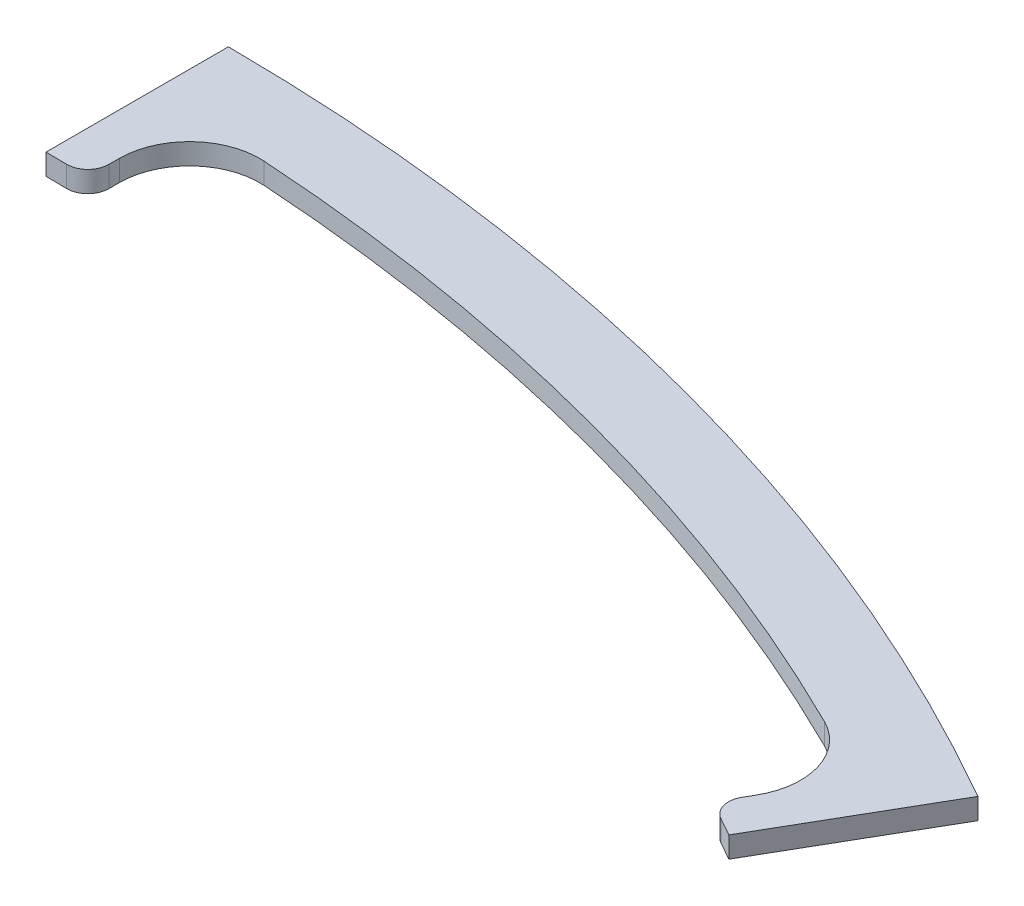
ISO-10303-21;
HEADER;
FILE_DESCRIPTION(('STEP AP214'),'2;1');
FILE_NAME('part.step','',(''),(''),'','','');
FILE_SCHEMA(('AUTOMOTIVE_DESIGN { 1 0 10303 214 1 1 1 1 }'));
ENDSEC;
DATA;
#1=APPLICATION_CONTEXT('core data for automotive mechanical design processes');
#2=APPLICATION_PROTOCOL_DEFINITION('international standard','automotive_design',2000,#1);
#3=PRODUCT_CONTEXT('',#1,'mechanical');
#4=PRODUCT('Part','Part','',(#3));
#5=PRODUCT_RELATED_PRODUCT_CATEGORY('part','',(#4));
#6=PRODUCT_DEFINITION_FORMATION('','',#4);
#7=PRODUCT_DEFINITION_CONTEXT('part definition',#1,'design');
#8=PRODUCT_DEFINITION('design','',#6,#7);
#9=PRODUCT_DEFINITION_SHAPE('','',#8);
#10=(LENGTH_UNIT() NAMED_UNIT(*) SI_UNIT(.MILLI.,.METRE.));
#11=(NAMED_UNIT(*) PLANE_ANGLE_UNIT() SI_UNIT($,.RADIAN.));
#12=(NAMED_UNIT(*) SI_UNIT($,.STERADIAN.) SOLID_ANGLE_UNIT());
#13=UNCERTAINTY_MEASURE_WITH_UNIT(LENGTH_MEASURE(1.E-05),#10,'distance_accuracy_value','');
#14=(GEOMETRIC_REPRESENTATION_CONTEXT(3) GLOBAL_UNCERTAINTY_ASSIGNED_CONTEXT((#13)) GLOBAL_UNIT_ASSIGNED_CONTEXT((#10,
#11,#12)) REPRESENTATION_CONTEXT('',''));
#15=CARTESIAN_POINT('',(0.,0.,0.));
#16=DIRECTION('',(0.,0.,1.));
#17=DIRECTION('',(1.,0.,0.));
#18=AXIS2_PLACEMENT_3D('',#15,#16,#17);
#19=CARTESIAN_POINT('',(0.,3.,0.));
#20=DIRECTION('',(0.,-1.,0.));
#21=DIRECTION('',(0.,0.,-1.));
#22=AXIS2_PLACEMENT_3D('',#19,#20,#21);
#23=CYLINDRICAL_SURFACE('',#22,271.500362135864);
#24=CARTESIAN_POINT('',(0.,0.,0.));
#25=DIRECTION('',(0.,-1.,0.));
#26=DIRECTION('',(0.,0.,-1.));
#27=AXIS2_PLACEMENT_3D('',#24,#25,#26);
#28=CIRCLE('',#27,271.500362135864);
#29=CARTESIAN_POINT('',(1.50000000000001,0.,-271.496218463361));
#30=VERTEX_POINT('',#29);
#31=CARTESIAN_POINT('',(4.45081973701253,0.,-271.463877603584));
#32=VERTEX_POINT('',#31);
#33=EDGE_CURVE('E219',#30,#32,#28,.T.);
#34=ORIENTED_EDGE('',*,*,#33,.T.);
#35=DIRECTION('',(0.,-1.,0.));
#36=VECTOR('',#35,1.);
#37=CARTESIAN_POINT('',(4.45081973701253,3.,-271.463877603584));
#38=LINE('',#37,#36);
#39=CARTESIAN_POINT('',(4.45081973701253,3.,-271.463877603584));
#40=VERTEX_POINT('',#39);
#41=EDGE_CURVE('E51',#32,#40,#38,.F.);
#42=ORIENTED_EDGE('',*,*,#41,.T.);
#43=CARTESIAN_POINT('',(0.,3.,0.));
#44=DIRECTION('',(0.,-1.,0.));
#45=DIRECTION('',(0.,0.,-1.));
#46=AXIS2_PLACEMENT_3D('',#43,#44,#45);
#47=CIRCLE('',#46,271.500362135864);
#48=CARTESIAN_POINT('',(1.50000000000001,3.,-271.496218463361));
#49=VERTEX_POINT('',#48);
#50=EDGE_CURVE('E218',#49,#40,#47,.T.);
#51=ORIENTED_EDGE('',*,*,#50,.F.);
#52=DIRECTION('',(0.,-1.,0.));
#53=VECTOR('',#52,1.);
#54=CARTESIAN_POINT('',(1.50000000000001,3.,-271.496218463361));
#55=LINE('',#54,#53);
#56=EDGE_CURVE('E140',#49,#30,#55,.T.);
#57=ORIENTED_EDGE('',*,*,#56,.T.);
#58=EDGE_LOOP('',(#34,#42,#51,#57));
#59=FACE_BOUND('',#58,.T.);
#60=ADVANCED_FACE('F42',(#59),#23,.F.);
#61=CARTESIAN_POINT('',(0.,3.,0.));
#62=DIRECTION('',(0.,-1.,0.));
#63=DIRECTION('',(0.,0.,-1.));
#64=AXIS2_PLACEMENT_3D('',#61,#62,#63);
#65=CYLINDRICAL_SURFACE('',#64,297.5);
#66=CARTESIAN_POINT('',(0.,0.,0.));
#67=DIRECTION('',(0.,1.,0.));
#68=DIRECTION('',(0.,0.,-1.));
#69=AXIS2_PLACEMENT_3D('',#66,#67,#68);
#70=CIRCLE('',#69,297.5);
#71=CARTESIAN_POINT('',(147.449071126004,0.,-258.389282719076));
#72=VERTEX_POINT('',#71);
#73=CARTESIAN_POINT('',(1.50000000000001,0.,-297.496218463361));
#74=VERTEX_POINT('',#73);
#75=EDGE_CURVE('E161',#72,#74,#70,.T.);
#76=ORIENTED_EDGE('',*,*,#75,.T.);
#77=DIRECTION('',(0.,-1.,0.));
#78=VECTOR('',#77,1.);
#79=CARTESIAN_POINT('',(1.50000000000001,3.,-297.496218463361));
#80=LINE('',#79,#78);
#81=CARTESIAN_POINT('',(1.50000000000001,3.,-297.496218463361));
#82=VERTEX_POINT('',#81);
#83=EDGE_CURVE('E137',#82,#74,#80,.T.);
#84=ORIENTED_EDGE('',*,*,#83,.F.);
#85=CARTESIAN_POINT('',(0.,3.,0.));
#86=DIRECTION('',(0.,1.,0.));
#87=DIRECTION('',(0.,0.,-1.));
#88=AXIS2_PLACEMENT_3D('',#85,#86,#87);
#89=CIRCLE('',#88,297.5);
#90=CARTESIAN_POINT('',(147.449071126004,3.,-258.389282719076));
#91=VERTEX_POINT('',#90);
#92=EDGE_CURVE('E146',#91,#82,#89,.T.);
#93=ORIENTED_EDGE('',*,*,#92,.F.);
#94=DIRECTION('',(0.,-1.,0.));
#95=VECTOR('',#94,1.);
#96=CARTESIAN_POINT('',(147.449071126004,3.,-258.389282719076));
#97=LINE('',#96,#95);
#98=EDGE_CURVE('E226',#91,#72,#97,.T.);
#99=ORIENTED_EDGE('',*,*,#98,.T.);
#100=EDGE_LOOP('',(#76,#84,#93,#99));
#101=FACE_BOUND('',#100,.T.);
#102=ADVANCED_FACE('F159',(#101),#65,.T.);
#103=CARTESIAN_POINT('',(1.50000000000001,3.,-297.496218463361));
#104=DIRECTION('',(1.,0.,0.));
#105=DIRECTION('',(0.,0.,-1.));
#106=AXIS2_PLACEMENT_3D('',#103,#104,#105);
#107=PLANE('',#106);
#108=DIRECTION('',(0.,0.,1.));
#109=VECTOR('',#108,1.);
#110=CARTESIAN_POINT('',(1.50000000000001,0.,-297.496218463361));
#111=LINE('',#110,#109);
#112=EDGE_CURVE('E231',#74,#30,#111,.T.);
#113=ORIENTED_EDGE('',*,*,#112,.T.);
#114=ORIENTED_EDGE('',*,*,#56,.F.);
#115=DIRECTION('',(0.,0.,1.));
#116=VECTOR('',#115,1.);
#117=CARTESIAN_POINT('',(1.50000000000001,3.,-297.496218463361));
#118=LINE('',#117,#116);
#119=EDGE_CURVE('E133',#82,#49,#118,.T.);
#120=ORIENTED_EDGE('',*,*,#119,.F.);
#121=ORIENTED_EDGE('',*,*,#83,.T.);
#122=EDGE_LOOP('',(#113,#114,#120,#121));
#123=FACE_BOUND('',#122,.T.);
#124=ADVANCED_FACE('F135',(#123),#107,.F.);
#125=CARTESIAN_POINT('',(131.877415841874,3.,-237.32002408304));
#126=VERTEX_POINT('',#125);
#127=CARTESIAN_POINT('',(134.449071126004,3.,-235.87262222068));
#128=VERTEX_POINT('',#127);
#129=EDGE_CURVE('E145',#126,#128,#47,.T.);
#130=ORIENTED_EDGE('',*,*,#129,.F.);
#131=DIRECTION('',(0.,-1.,0.));
#132=VECTOR('',#131,1.);
#133=CARTESIAN_POINT('',(131.877415841874,3.,-237.32002408304));
#134=LINE('',#133,#132);
#135=CARTESIAN_POINT('',(131.877415841874,0.,-237.32002408304));
#136=VERTEX_POINT('',#135);
#137=EDGE_CURVE('E207',#126,#136,#134,.T.);
#138=ORIENTED_EDGE('',*,*,#137,.T.);
#139=CARTESIAN_POINT('',(134.449071126004,0.,-235.87262222068));
#140=VERTEX_POINT('',#139);
#141=EDGE_CURVE('E235',#136,#140,#28,.T.);
#142=ORIENTED_EDGE('',*,*,#141,.T.);
#143=DIRECTION('',(0.,-1.,0.));
#144=VECTOR('',#143,1.);
#145=CARTESIAN_POINT('',(134.449071126004,3.,-235.87262222068));
#146=LINE('',#145,#144);
#147=EDGE_CURVE('E170',#128,#140,#146,.T.);
#148=ORIENTED_EDGE('',*,*,#147,.F.);
#149=EDGE_LOOP('',(#130,#138,#142,#148));
#150=FACE_BOUND('',#149,.T.);
#151=ADVANCED_FACE('F290',(#150),#23,.F.);
#152=CARTESIAN_POINT('',(147.449071126004,3.,-258.389282719076));
#153=DIRECTION('',(-0.866025403784438,0.,-0.500000000000001));
#154=DIRECTION('',(-0.500000000000001,0.,0.866025403784438));
#155=AXIS2_PLACEMENT_3D('',#152,#153,#154);
#156=PLANE('',#155);
#157=DIRECTION('',(0.500000000000001,0.,-0.866025403784438));
#158=VECTOR('',#157,1.);
#159=CARTESIAN_POINT('',(147.449071126004,0.,-258.389282719076));
#160=LINE('',#159,#158);
#161=EDGE_CURVE('E157',#140,#72,#160,.T.);
#162=ORIENTED_EDGE('',*,*,#161,.T.);
#163=ORIENTED_EDGE('',*,*,#98,.F.);
#164=DIRECTION('',(0.500000000000001,0.,-0.866025403784438));
#165=VECTOR('',#164,1.);
#166=CARTESIAN_POINT('',(147.449071126004,3.,-258.389282719076));
#167=LINE('',#166,#165);
#168=EDGE_CURVE('E152',#128,#91,#167,.T.);
#169=ORIENTED_EDGE('',*,*,#168,.F.);
#170=ORIENTED_EDGE('',*,*,#147,.T.);
#171=EDGE_LOOP('',(#162,#163,#169,#170));
#172=FACE_BOUND('',#171,.T.);
#173=ADVANCED_FACE('F246',(#172),#156,.F.);
#174=CARTESIAN_POINT('',(0.,3.,0.));
#175=DIRECTION('',(0.,-1.,0.));
#176=DIRECTION('',(0.,0.,-1.));
#177=AXIS2_PLACEMENT_3D('',#174,#175,#176);
#178=PLANE('',#177);
#179=DIRECTION('',(0.5,0.,-0.866025403784438));
#180=VECTOR('',#179,1.);
#181=CARTESIAN_POINT('',(129.203185143459,3.,-238.786481168198));
#182=LINE('',#181,#180);
#183=CARTESIAN_POINT('',(130.736546701677,3.,-241.442341293404));
#184=VERTEX_POINT('',#183);
#185=CARTESIAN_POINT('',(131.477814314289,3.,-242.726254460454));
#186=VERTEX_POINT('',#185);
#187=EDGE_CURVE('E260',#184,#186,#182,.T.);
#188=ORIENTED_EDGE('',*,*,#187,.F.);
#189=CARTESIAN_POINT('',(133.33462291303,3.,-239.942341293404));
#190=DIRECTION('',(0.,-1.,0.));
#191=DIRECTION('',(0.,0.,-1.));
#192=AXIS2_PLACEMENT_3D('',#189,#190,#191);
#193=CIRCLE('',#192,3.);
#194=EDGE_CURVE('E204',#184,#126,#193,.F.);
#195=ORIENTED_EDGE('',*,*,#194,.T.);
#196=ORIENTED_EDGE('',*,*,#129,.T.);
#197=ORIENTED_EDGE('',*,*,#168,.T.);
#198=ORIENTED_EDGE('',*,*,#92,.T.);
#199=ORIENTED_EDGE('',*,*,#119,.T.);
#200=ORIENTED_EDGE('',*,*,#50,.T.);
#201=CARTESIAN_POINT('',(4.50000000000001,3.,-274.463474460119));
#202=DIRECTION('',(0.,-1.,0.));
#203=DIRECTION('',(0.,0.,-1.));
#204=AXIS2_PLACEMENT_3D('',#201,#202,#203);
#205=CIRCLE('',#204,3.);
#206=CARTESIAN_POINT('',(7.50000000000001,3.,-274.463474460119));
#207=VERTEX_POINT('',#206);
#208=EDGE_CURVE('E201',#40,#207,#205,.F.);
#209=ORIENTED_EDGE('',*,*,#208,.T.);
#210=DIRECTION('',(0.,0.,1.));
#211=VECTOR('',#210,1.);
#212=CARTESIAN_POINT('',(7.50000000000001,3.,-286.402177896714));
#213=LINE('',#212,#211);
#214=CARTESIAN_POINT('',(7.50000000000001,3.,-275.946009685344));
#215=VERTEX_POINT('',#214);
#216=EDGE_CURVE('E266',#215,#207,#213,.T.);
#217=ORIENTED_EDGE('',*,*,#216,.F.);
#218=CARTESIAN_POINT('',(17.5,3.,-275.946009685344));
#219=DIRECTION('',(0.,-1.,0.));
#220=DIRECTION('',(0.,0.,-1.));
#221=AXIS2_PLACEMENT_3D('',#218,#219,#220);
#222=CIRCLE('',#221,10.);
#223=CARTESIAN_POINT('',(18.1329105634734,3.,-285.925960798383));
#224=VERTEX_POINT('',#223);
#225=EDGE_CURVE('E184',#215,#224,#222,.T.);
#226=ORIENTED_EDGE('',*,*,#225,.T.);
#227=CARTESIAN_POINT('',(0.,3.,0.));
#228=DIRECTION('',(0.,1.,0.));
#229=DIRECTION('',(0.,0.,1.));
#230=AXIS2_PLACEMENT_3D('',#227,#228,#229);
#231=CIRCLE('',#230,286.500362135864);
#232=CARTESIAN_POINT('',(127.259419206672,3.,-256.685600934609));
#233=VERTEX_POINT('',#232);
#234=EDGE_CURVE('E265',#233,#224,#231,.T.);
#235=ORIENTED_EDGE('',*,*,#234,.F.);
#236=CARTESIAN_POINT('',(122.817560276445,3.,-247.726254460454));
#237=DIRECTION('',(0.,-1.,0.));
#238=DIRECTION('',(0.,0.,-1.));
#239=AXIS2_PLACEMENT_3D('',#236,#237,#238);
#240=CIRCLE('',#239,10.);
#241=EDGE_CURVE('E190',#233,#186,#240,.T.);
#242=ORIENTED_EDGE('',*,*,#241,.T.);
#243=EDGE_LOOP('',(#188,#195,#196,#197,#198,#199,#200,#209,#217,#226,#235,#242));
#244=FACE_BOUND('',#243,.T.);
#245=ADVANCED_FACE('F150',(#244),#178,.F.);
#246=CARTESIAN_POINT('',(0.,0.,0.));
#247=DIRECTION('',(0.,-1.,0.));
#248=DIRECTION('',(0.,0.,-1.));
#249=AXIS2_PLACEMENT_3D('',#246,#247,#248);
#250=PLANE('',#249);
#251=ORIENTED_EDGE('',*,*,#141,.F.);
#252=CARTESIAN_POINT('',(133.33462291303,0.,-239.942341293404));
#253=DIRECTION('',(0.,-1.,0.));
#254=DIRECTION('',(0.,0.,-1.));
#255=AXIS2_PLACEMENT_3D('',#252,#253,#254);
#256=CIRCLE('',#255,3.);
#257=CARTESIAN_POINT('',(130.736546701677,0.,-241.442341293404));
#258=VERTEX_POINT('',#257);
#259=EDGE_CURVE('E212',#136,#258,#256,.T.);
#260=ORIENTED_EDGE('',*,*,#259,.T.);
#261=DIRECTION('',(0.5,0.,-0.866025403784438));
#262=VECTOR('',#261,1.);
#263=CARTESIAN_POINT('',(129.203185143459,0.,-238.786481168198));
#264=LINE('',#263,#262);
#265=CARTESIAN_POINT('',(131.477814314289,0.,-242.726254460454));
#266=VERTEX_POINT('',#265);
#267=EDGE_CURVE('E261',#258,#266,#264,.T.);
#268=ORIENTED_EDGE('',*,*,#267,.T.);
#269=CARTESIAN_POINT('',(122.817560276445,0.,-247.726254460454));
#270=DIRECTION('',(0.,-1.,0.));
#271=DIRECTION('',(0.,0.,-1.));
#272=AXIS2_PLACEMENT_3D('',#269,#270,#271);
#273=CIRCLE('',#272,10.);
#274=CARTESIAN_POINT('',(127.259419206672,0.,-256.685600934609));
#275=VERTEX_POINT('',#274);
#276=EDGE_CURVE('E194',#266,#275,#273,.F.);
#277=ORIENTED_EDGE('',*,*,#276,.T.);
#278=CARTESIAN_POINT('',(0.,0.,0.));
#279=DIRECTION('',(0.,1.,0.));
#280=DIRECTION('',(0.,0.,1.));
#281=AXIS2_PLACEMENT_3D('',#278,#279,#280);
#282=CIRCLE('',#281,286.500362135864);
#283=CARTESIAN_POINT('',(18.1329105634734,0.,-285.925960798383));
#284=VERTEX_POINT('',#283);
#285=EDGE_CURVE('E232',#275,#284,#282,.T.);
#286=ORIENTED_EDGE('',*,*,#285,.T.);
#287=CARTESIAN_POINT('',(17.5,0.,-275.946009685344));
#288=DIRECTION('',(0.,-1.,0.));
#289=DIRECTION('',(0.,0.,-1.));
#290=AXIS2_PLACEMENT_3D('',#287,#288,#289);
#291=CIRCLE('',#290,10.);
#292=CARTESIAN_POINT('',(7.50000000000001,0.,-275.946009685344));
#293=VERTEX_POINT('',#292);
#294=EDGE_CURVE('E187',#284,#293,#291,.F.);
#295=ORIENTED_EDGE('',*,*,#294,.T.);
#296=DIRECTION('',(0.,0.,1.));
#297=VECTOR('',#296,1.);
#298=CARTESIAN_POINT('',(7.50000000000001,0.,-286.402177896714));
#299=LINE('',#298,#297);
#300=CARTESIAN_POINT('',(7.50000000000001,0.,-274.463474460119));
#301=VERTEX_POINT('',#300);
#302=EDGE_CURVE('E271',#293,#301,#299,.T.);
#303=ORIENTED_EDGE('',*,*,#302,.T.);
#304=CARTESIAN_POINT('',(4.50000000000001,0.,-274.463474460119));
#305=DIRECTION('',(0.,-1.,0.));
#306=DIRECTION('',(0.,0.,-1.));
#307=AXIS2_PLACEMENT_3D('',#304,#305,#306);
#308=CIRCLE('',#307,3.);
#309=EDGE_CURVE('E58',#301,#32,#308,.T.);
#310=ORIENTED_EDGE('',*,*,#309,.T.);
#311=ORIENTED_EDGE('',*,*,#33,.F.);
#312=ORIENTED_EDGE('',*,*,#112,.F.);
#313=ORIENTED_EDGE('',*,*,#75,.F.);
#314=ORIENTED_EDGE('',*,*,#161,.F.);
#315=EDGE_LOOP('',(#251,#260,#268,#277,#286,#295,#303,#310,#311,#312,#313,#314));
#316=FACE_BOUND('',#315,.T.);
#317=ADVANCED_FACE('F250',(#316),#250,.T.);
#318=CARTESIAN_POINT('',(7.50000000000001,0.,-286.402177896714));
#319=DIRECTION('',(-1.,0.,0.));
#320=DIRECTION('',(0.,0.,1.));
#321=AXIS2_PLACEMENT_3D('',#318,#319,#320);
#322=PLANE('',#321);
#323=ORIENTED_EDGE('',*,*,#216,.T.);
#324=DIRECTION('',(0.,-1.,0.));
#325=VECTOR('',#324,1.);
#326=CARTESIAN_POINT('',(7.50000000000001,0.,-274.463474460119));
#327=LINE('',#326,#325);
#328=EDGE_CURVE('E11',#207,#301,#327,.T.);
#329=ORIENTED_EDGE('',*,*,#328,.T.);
#330=ORIENTED_EDGE('',*,*,#302,.F.);
#331=DIRECTION('',(0.,-1.,0.));
#332=VECTOR('',#331,1.);
#333=CARTESIAN_POINT('',(7.50000000000001,3.,-275.946009685344));
#334=LINE('',#333,#332);
#335=EDGE_CURVE('E163',#293,#215,#334,.F.);
#336=ORIENTED_EDGE('',*,*,#335,.T.);
#337=EDGE_LOOP('',(#323,#329,#330,#336));
#338=FACE_BOUND('',#337,.T.);
#339=ADVANCED_FACE('F320',(#338),#322,.F.);
#340=CARTESIAN_POINT('',(0.,0.,0.));
#341=DIRECTION('',(0.,1.,0.));
#342=DIRECTION('',(0.,0.,1.));
#343=AXIS2_PLACEMENT_3D('',#340,#341,#342);
#344=CYLINDRICAL_SURFACE('',#343,286.500362135864);
#345=ORIENTED_EDGE('',*,*,#234,.T.);
#346=DIRECTION('',(0.,1.,0.));
#347=VECTOR('',#346,1.);
#348=CARTESIAN_POINT('',(18.1329105634734,0.,-285.925960798383));
#349=LINE('',#348,#347);
#350=EDGE_CURVE('E177',#224,#284,#349,.F.);
#351=ORIENTED_EDGE('',*,*,#350,.T.);
#352=ORIENTED_EDGE('',*,*,#285,.F.);
#353=DIRECTION('',(0.,1.,0.));
#354=VECTOR('',#353,1.);
#355=CARTESIAN_POINT('',(127.259419206672,0.,-256.685600934609));
#356=LINE('',#355,#354);
#357=EDGE_CURVE('E168',#275,#233,#356,.T.);
#358=ORIENTED_EDGE('',*,*,#357,.T.);
#359=EDGE_LOOP('',(#345,#351,#352,#358));
#360=FACE_BOUND('',#359,.T.);
#361=ADVANCED_FACE('F318',(#360),#344,.F.);
#362=CARTESIAN_POINT('',(129.203185143459,0.,-238.786481168198));
#363=DIRECTION('',(0.866025403784438,0.,0.5));
#364=DIRECTION('',(0.5,0.,-0.866025403784438));
#365=AXIS2_PLACEMENT_3D('',#362,#363,#364);
#366=PLANE('',#365);
#367=ORIENTED_EDGE('',*,*,#267,.F.);
#368=DIRECTION('',(0.,-1.,0.));
#369=VECTOR('',#368,1.);
#370=CARTESIAN_POINT('',(130.736546701677,0.,-241.442341293404));
#371=LINE('',#370,#369);
#372=EDGE_CURVE('E197',#258,#184,#371,.F.);
#373=ORIENTED_EDGE('',*,*,#372,.T.);
#374=ORIENTED_EDGE('',*,*,#187,.T.);
#375=DIRECTION('',(0.,-1.,0.));
#376=VECTOR('',#375,1.);
#377=CARTESIAN_POINT('',(131.477814314289,0.,-242.726254460454));
#378=LINE('',#377,#376);
#379=EDGE_CURVE('E180',#186,#266,#378,.T.);
#380=ORIENTED_EDGE('',*,*,#379,.T.);
#381=EDGE_LOOP('',(#367,#373,#374,#380));
#382=FACE_BOUND('',#381,.T.);
#383=ADVANCED_FACE('F259',(#382),#366,.F.);
#384=CARTESIAN_POINT('',(17.5,0.,-275.946009685344));
#385=DIRECTION('',(0.,1.,0.));
#386=DIRECTION('',(0.,0.,1.));
#387=AXIS2_PLACEMENT_3D('',#384,#385,#386);
#388=CYLINDRICAL_SURFACE('',#387,10.);
#389=ORIENTED_EDGE('',*,*,#294,.F.);
#390=ORIENTED_EDGE('',*,*,#350,.F.);
#391=ORIENTED_EDGE('',*,*,#225,.F.);
#392=ORIENTED_EDGE('',*,*,#335,.F.);
#393=EDGE_LOOP('',(#389,#390,#391,#392));
#394=FACE_BOUND('',#393,.T.);
#395=ADVANCED_FACE('F307',(#394),#388,.F.);
#396=CARTESIAN_POINT('',(122.817560276445,0.,-247.726254460454));
#397=DIRECTION('',(0.,1.,0.));
#398=DIRECTION('',(0.,0.,1.));
#399=AXIS2_PLACEMENT_3D('',#396,#397,#398);
#400=CYLINDRICAL_SURFACE('',#399,10.);
#401=ORIENTED_EDGE('',*,*,#276,.F.);
#402=ORIENTED_EDGE('',*,*,#379,.F.);
#403=ORIENTED_EDGE('',*,*,#241,.F.);
#404=ORIENTED_EDGE('',*,*,#357,.F.);
#405=EDGE_LOOP('',(#401,#402,#403,#404));
#406=FACE_BOUND('',#405,.T.);
#407=ADVANCED_FACE('F287',(#406),#400,.F.);
#408=CARTESIAN_POINT('',(133.33462291303,3.,-239.942341293404));
#409=DIRECTION('',(0.,-1.,0.));
#410=DIRECTION('',(0.,0.,-1.));
#411=AXIS2_PLACEMENT_3D('',#408,#409,#410);
#412=CYLINDRICAL_SURFACE('',#411,3.);
#413=ORIENTED_EDGE('',*,*,#259,.F.);
#414=ORIENTED_EDGE('',*,*,#137,.F.);
#415=ORIENTED_EDGE('',*,*,#194,.F.);
#416=ORIENTED_EDGE('',*,*,#372,.F.);
#417=EDGE_LOOP('',(#413,#414,#415,#416));
#418=FACE_BOUND('',#417,.T.);
#419=ADVANCED_FACE('F257',(#418),#412,.T.);
#420=CARTESIAN_POINT('',(4.50000000000001,3.,-274.463474460119));
#421=DIRECTION('',(0.,-1.,0.));
#422=DIRECTION('',(0.,0.,-1.));
#423=AXIS2_PLACEMENT_3D('',#420,#421,#422);
#424=CYLINDRICAL_SURFACE('',#423,3.);
#425=ORIENTED_EDGE('',*,*,#309,.F.);
#426=ORIENTED_EDGE('',*,*,#328,.F.);
#427=ORIENTED_EDGE('',*,*,#208,.F.);
#428=ORIENTED_EDGE('',*,*,#41,.F.);
#429=EDGE_LOOP('',(#425,#426,#427,#428));
#430=FACE_BOUND('',#429,.T.);
#431=ADVANCED_FACE('F44',(#430),#424,.T.);
#432=CLOSED_SHELL('',(#60,#102,#124,#151,#173,#245,#317,#339,#361,#383,#395,#407,#419,#431));
#433=MANIFOLD_SOLID_BREP('B2',#432);
#434=ADVANCED_BREP_SHAPE_REPRESENTATION('',(#18,#433),#14);
#435=SHAPE_DEFINITION_REPRESENTATION(#9,#434);
ENDSEC;
END-ISO-10303-21;
